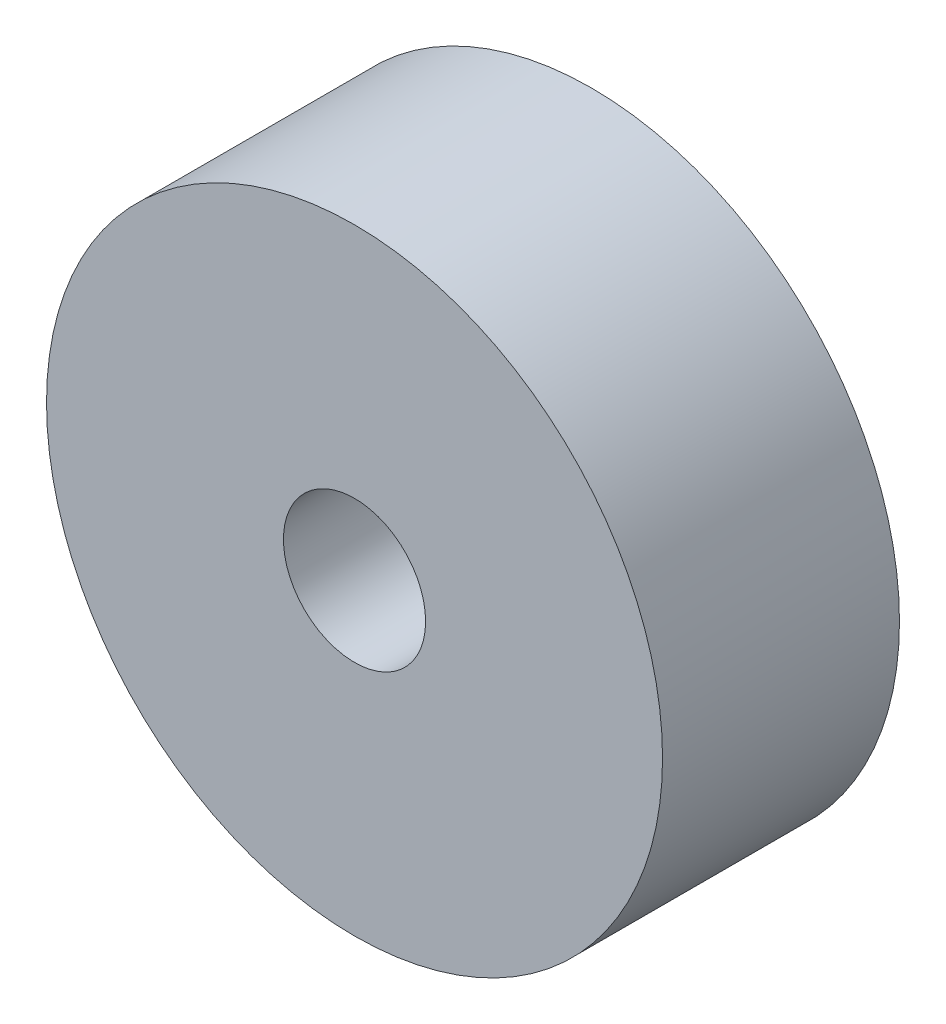
ISO-10303-21;
HEADER;
FILE_DESCRIPTION(('STEP AP214'),'2;1');
FILE_NAME('part.step','',(''),(''),'','','');
FILE_SCHEMA(('AUTOMOTIVE_DESIGN { 1 0 10303 214 1 1 1 1 }'));
ENDSEC;
DATA;
#1=APPLICATION_CONTEXT('core data for automotive mechanical design processes');
#2=APPLICATION_PROTOCOL_DEFINITION('international standard','automotive_design',2000,#1);
#3=PRODUCT_CONTEXT('',#1,'mechanical');
#4=PRODUCT('Part','Part','',(#3));
#5=PRODUCT_RELATED_PRODUCT_CATEGORY('part','',(#4));
#6=PRODUCT_DEFINITION_FORMATION('','',#4);
#7=PRODUCT_DEFINITION_CONTEXT('part definition',#1,'design');
#8=PRODUCT_DEFINITION('design','',#6,#7);
#9=PRODUCT_DEFINITION_SHAPE('','',#8);
#10=(LENGTH_UNIT() NAMED_UNIT(*) SI_UNIT(.MILLI.,.METRE.));
#11=(NAMED_UNIT(*) PLANE_ANGLE_UNIT() SI_UNIT($,.RADIAN.));
#12=(NAMED_UNIT(*) SI_UNIT($,.STERADIAN.) SOLID_ANGLE_UNIT());
#13=UNCERTAINTY_MEASURE_WITH_UNIT(LENGTH_MEASURE(1.E-05),#10,'distance_accuracy_value','');
#14=(GEOMETRIC_REPRESENTATION_CONTEXT(3) GLOBAL_UNCERTAINTY_ASSIGNED_CONTEXT((#13)) GLOBAL_UNIT_ASSIGNED_CONTEXT((#10,
#11,#12)) REPRESENTATION_CONTEXT('',''));
#15=CARTESIAN_POINT('',(0.,0.,0.));
#16=DIRECTION('',(0.,0.,1.));
#17=DIRECTION('',(1.,0.,0.));
#18=AXIS2_PLACEMENT_3D('',#15,#16,#17);
#19=CARTESIAN_POINT('',(0.,0.,5.));
#20=DIRECTION('',(0.,0.,1.));
#21=DIRECTION('',(1.,0.,0.));
#22=AXIS2_PLACEMENT_3D('',#19,#20,#21);
#23=PLANE('',#22);
#24=CARTESIAN_POINT('',(0.,0.,5.));
#25=DIRECTION('',(0.,0.,1.));
#26=DIRECTION('',(1.,0.,0.));
#27=AXIS2_PLACEMENT_3D('',#24,#25,#26);
#28=CIRCLE('',#27,6.5);
#29=CARTESIAN_POINT('',(6.5,0.,5.));
#30=VERTEX_POINT('',#29);
#31=EDGE_CURVE('E10',#30,#30,#28,.T.);
#32=ORIENTED_EDGE('',*,*,#31,.T.);
#33=EDGE_LOOP('',(#32));
#34=FACE_BOUND('',#33,.T.);
#35=CARTESIAN_POINT('',(0.,0.,5.));
#36=DIRECTION('',(0.,0.,1.));
#37=DIRECTION('',(1.,0.,0.));
#38=AXIS2_PLACEMENT_3D('',#35,#36,#37);
#39=CIRCLE('',#38,1.5);
#40=CARTESIAN_POINT('',(1.5,0.,5.));
#41=VERTEX_POINT('',#40);
#42=EDGE_CURVE('E56',#41,#41,#39,.T.);
#43=ORIENTED_EDGE('',*,*,#42,.F.);
#44=EDGE_LOOP('',(#43));
#45=FACE_BOUND('',#44,.T.);
#46=ADVANCED_FACE('F43',(#34,#45),#23,.T.);
#47=CARTESIAN_POINT('',(0.,0.,0.));
#48=DIRECTION('',(0.,0.,1.));
#49=DIRECTION('',(1.,0.,0.));
#50=AXIS2_PLACEMENT_3D('',#47,#48,#49);
#51=PLANE('',#50);
#52=CARTESIAN_POINT('',(0.,0.,0.));
#53=DIRECTION('',(0.,0.,1.));
#54=DIRECTION('',(1.,0.,0.));
#55=AXIS2_PLACEMENT_3D('',#52,#53,#54);
#56=CIRCLE('',#55,6.5);
#57=CARTESIAN_POINT('',(6.5,0.,0.));
#58=VERTEX_POINT('',#57);
#59=EDGE_CURVE('E47',#58,#58,#56,.T.);
#60=ORIENTED_EDGE('',*,*,#59,.F.);
#61=EDGE_LOOP('',(#60));
#62=FACE_BOUND('',#61,.T.);
#63=CARTESIAN_POINT('',(0.,0.,0.));
#64=DIRECTION('',(0.,0.,1.));
#65=DIRECTION('',(1.,0.,0.));
#66=AXIS2_PLACEMENT_3D('',#63,#64,#65);
#67=CIRCLE('',#66,1.5);
#68=CARTESIAN_POINT('',(1.5,0.,0.));
#69=VERTEX_POINT('',#68);
#70=EDGE_CURVE('E58',#69,#69,#67,.T.);
#71=ORIENTED_EDGE('',*,*,#70,.T.);
#72=EDGE_LOOP('',(#71));
#73=FACE_BOUND('',#72,.T.);
#74=ADVANCED_FACE('F70',(#62,#73),#51,.F.);
#75=CARTESIAN_POINT('',(0.,0.,5.));
#76=DIRECTION('',(0.,0.,-1.));
#77=DIRECTION('',(-1.,0.,0.));
#78=AXIS2_PLACEMENT_3D('',#75,#76,#77);
#79=CYLINDRICAL_SURFACE('',#78,6.5);
#80=ORIENTED_EDGE('',*,*,#31,.F.);
#81=EDGE_LOOP('',(#80));
#82=FACE_BOUND('',#81,.T.);
#83=ORIENTED_EDGE('',*,*,#59,.T.);
#84=EDGE_LOOP('',(#83));
#85=FACE_BOUND('',#84,.T.);
#86=ADVANCED_FACE('F45',(#82,#85),#79,.T.);
#87=CARTESIAN_POINT('',(0.,0.,5.));
#88=DIRECTION('',(0.,0.,-1.));
#89=DIRECTION('',(-1.,0.,0.));
#90=AXIS2_PLACEMENT_3D('',#87,#88,#89);
#91=CYLINDRICAL_SURFACE('',#90,1.5);
#92=ORIENTED_EDGE('',*,*,#42,.T.);
#93=EDGE_LOOP('',(#92));
#94=FACE_BOUND('',#93,.T.);
#95=ORIENTED_EDGE('',*,*,#70,.F.);
#96=EDGE_LOOP('',(#95));
#97=FACE_BOUND('',#96,.T.);
#98=ADVANCED_FACE('F66',(#94,#97),#91,.F.);
#99=CLOSED_SHELL('',(#46,#74,#86,#98));
#100=MANIFOLD_SOLID_BREP('B2',#99);
#101=ADVANCED_BREP_SHAPE_REPRESENTATION('',(#18,#100),#14);
#102=SHAPE_DEFINITION_REPRESENTATION(#9,#101);
ENDSEC;
END-ISO-10303-21;
